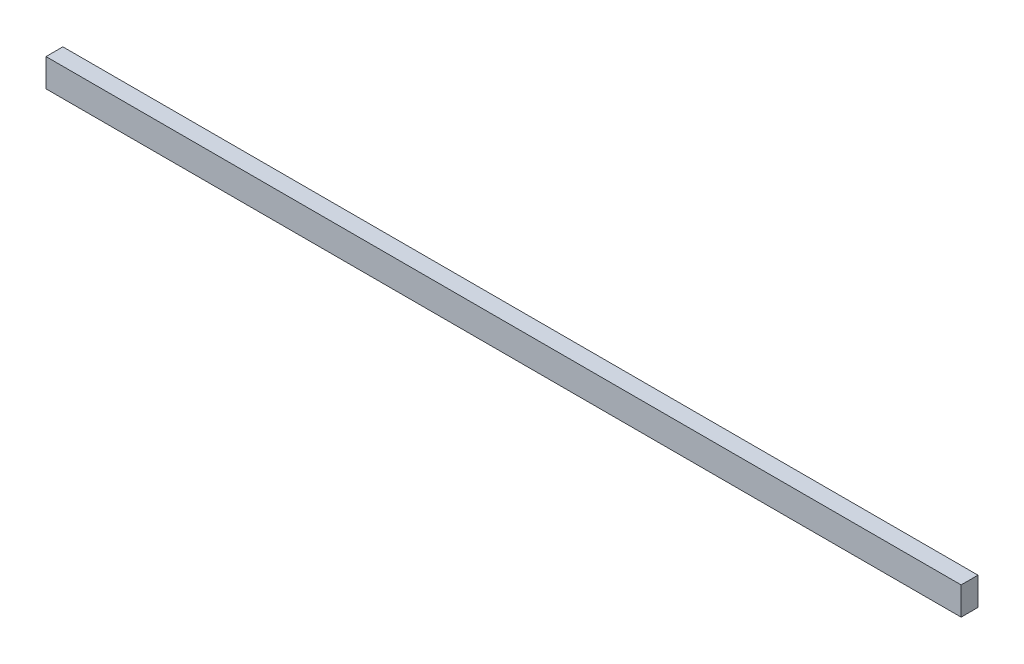
ISO-10303-21;
HEADER;
FILE_DESCRIPTION(('STEP AP214'),'2;1');
FILE_NAME('part.step','',(''),(''),'','','');
FILE_SCHEMA(('AUTOMOTIVE_DESIGN { 1 0 10303 214 1 1 1 1 }'));
ENDSEC;
DATA;
#1=APPLICATION_CONTEXT('core data for automotive mechanical design processes');
#2=APPLICATION_PROTOCOL_DEFINITION('international standard','automotive_design',2000,#1);
#3=PRODUCT_CONTEXT('',#1,'mechanical');
#4=PRODUCT('Part','Part','',(#3));
#5=PRODUCT_RELATED_PRODUCT_CATEGORY('part','',(#4));
#6=PRODUCT_DEFINITION_FORMATION('','',#4);
#7=PRODUCT_DEFINITION_CONTEXT('part definition',#1,'design');
#8=PRODUCT_DEFINITION('design','',#6,#7);
#9=PRODUCT_DEFINITION_SHAPE('','',#8);
#10=(LENGTH_UNIT() NAMED_UNIT(*) SI_UNIT(.MILLI.,.METRE.));
#11=(NAMED_UNIT(*) PLANE_ANGLE_UNIT() SI_UNIT($,.RADIAN.));
#12=(NAMED_UNIT(*) SI_UNIT($,.STERADIAN.) SOLID_ANGLE_UNIT());
#13=UNCERTAINTY_MEASURE_WITH_UNIT(LENGTH_MEASURE(1.E-05),#10,'distance_accuracy_value','');
#14=(GEOMETRIC_REPRESENTATION_CONTEXT(3) GLOBAL_UNCERTAINTY_ASSIGNED_CONTEXT((#13)) GLOBAL_UNIT_ASSIGNED_CONTEXT((#10,
#11,#12)) REPRESENTATION_CONTEXT('',''));
#15=CARTESIAN_POINT('',(0.,0.,0.));
#16=DIRECTION('',(0.,0.,1.));
#17=DIRECTION('',(1.,0.,0.));
#18=AXIS2_PLACEMENT_3D('',#15,#16,#17);
#19=CARTESIAN_POINT('',(571.499999999999,17.4667625569214,-12.7));
#20=DIRECTION('',(1.,0.,0.));
#21=DIRECTION('',(0.,0.,-1.));
#22=AXIS2_PLACEMENT_3D('',#19,#20,#21);
#23=PLANE('',#22);
#24=DIRECTION('',(0.,0.,1.));
#25=VECTOR('',#24,1.);
#26=CARTESIAN_POINT('',(571.499999999999,17.4667625569214,-12.7));
#27=LINE('',#26,#25);
#28=CARTESIAN_POINT('',(571.499999999999,17.4667625569214,-12.7));
#29=VERTEX_POINT('',#28);
#30=CARTESIAN_POINT('',(571.499999999999,17.4667625569214,8.382));
#31=VERTEX_POINT('',#30);
#32=EDGE_CURVE('E42',#29,#31,#27,.T.);
#33=ORIENTED_EDGE('',*,*,#32,.T.);
#34=DIRECTION('',(0.,1.,0.));
#35=VECTOR('',#34,1.);
#36=CARTESIAN_POINT('',(571.499999999999,17.4667625569214,8.382));
#37=LINE('',#36,#35);
#38=CARTESIAN_POINT('',(571.499999999999,-17.4667625569214,8.382));
#39=VERTEX_POINT('',#38);
#40=EDGE_CURVE('E80',#39,#31,#37,.T.);
#41=ORIENTED_EDGE('',*,*,#40,.F.);
#42=DIRECTION('',(0.,0.,1.));
#43=VECTOR('',#42,1.);
#44=CARTESIAN_POINT('',(571.499999999999,-17.4667625569214,-12.7));
#45=LINE('',#44,#43);
#46=CARTESIAN_POINT('',(571.499999999999,-17.4667625569214,-12.7));
#47=VERTEX_POINT('',#46);
#48=EDGE_CURVE('E11',#47,#39,#45,.T.);
#49=ORIENTED_EDGE('',*,*,#48,.F.);
#50=DIRECTION('',(0.,1.,0.));
#51=VECTOR('',#50,1.);
#52=CARTESIAN_POINT('',(571.499999999999,17.4667625569214,-12.7));
#53=LINE('',#52,#51);
#54=EDGE_CURVE('E81',#47,#29,#53,.T.);
#55=ORIENTED_EDGE('',*,*,#54,.T.);
#56=EDGE_LOOP('',(#33,#41,#49,#55));
#57=FACE_BOUND('',#56,.T.);
#58=ADVANCED_FACE('F39',(#57),#23,.T.);
#59=CARTESIAN_POINT('',(-571.500000000001,-17.4667625569214,-12.7));
#60=DIRECTION('',(0.,-1.,0.));
#61=DIRECTION('',(0.,0.,-1.));
#62=AXIS2_PLACEMENT_3D('',#59,#60,#61);
#63=PLANE('',#62);
#64=ORIENTED_EDGE('',*,*,#48,.T.);
#65=DIRECTION('',(1.,0.,0.));
#66=VECTOR('',#65,1.);
#67=CARTESIAN_POINT('',(-571.500000000001,-17.4667625569214,8.382));
#68=LINE('',#67,#66);
#69=CARTESIAN_POINT('',(-571.500000000001,-17.4667625569214,8.382));
#70=VERTEX_POINT('',#69);
#71=EDGE_CURVE('E99',#70,#39,#68,.T.);
#72=ORIENTED_EDGE('',*,*,#71,.F.);
#73=DIRECTION('',(0.,0.,1.));
#74=VECTOR('',#73,1.);
#75=CARTESIAN_POINT('',(-571.500000000001,-17.4667625569214,-12.7));
#76=LINE('',#75,#74);
#77=CARTESIAN_POINT('',(-571.500000000001,-17.4667625569214,-12.7));
#78=VERTEX_POINT('',#77);
#79=EDGE_CURVE('E48',#78,#70,#76,.T.);
#80=ORIENTED_EDGE('',*,*,#79,.F.);
#81=DIRECTION('',(1.,0.,0.));
#82=VECTOR('',#81,1.);
#83=CARTESIAN_POINT('',(-571.500000000001,-17.4667625569214,-12.7));
#84=LINE('',#83,#82);
#85=EDGE_CURVE('E87',#78,#47,#84,.T.);
#86=ORIENTED_EDGE('',*,*,#85,.T.);
#87=EDGE_LOOP('',(#64,#72,#80,#86));
#88=FACE_BOUND('',#87,.T.);
#89=ADVANCED_FACE('F123',(#88),#63,.T.);
#90=CARTESIAN_POINT('',(-571.500000000001,17.4667625569214,-12.7));
#91=DIRECTION('',(-1.,0.,0.));
#92=DIRECTION('',(0.,0.,1.));
#93=AXIS2_PLACEMENT_3D('',#90,#91,#92);
#94=PLANE('',#93);
#95=ORIENTED_EDGE('',*,*,#79,.T.);
#96=DIRECTION('',(0.,-1.,0.));
#97=VECTOR('',#96,1.);
#98=CARTESIAN_POINT('',(-571.500000000001,17.4667625569214,8.382));
#99=LINE('',#98,#97);
#100=CARTESIAN_POINT('',(-571.500000000001,17.4667625569214,8.382));
#101=VERTEX_POINT('',#100);
#102=EDGE_CURVE('E95',#101,#70,#99,.T.);
#103=ORIENTED_EDGE('',*,*,#102,.F.);
#104=DIRECTION('',(0.,0.,1.));
#105=VECTOR('',#104,1.);
#106=CARTESIAN_POINT('',(-571.500000000001,17.4667625569214,-12.7));
#107=LINE('',#106,#105);
#108=CARTESIAN_POINT('',(-571.500000000001,17.4667625569214,-12.7));
#109=VERTEX_POINT('',#108);
#110=EDGE_CURVE('E86',#109,#101,#107,.T.);
#111=ORIENTED_EDGE('',*,*,#110,.F.);
#112=DIRECTION('',(0.,-1.,0.));
#113=VECTOR('',#112,1.);
#114=CARTESIAN_POINT('',(-571.500000000001,17.4667625569214,-12.7));
#115=LINE('',#114,#113);
#116=EDGE_CURVE('E112',#109,#78,#115,.T.);
#117=ORIENTED_EDGE('',*,*,#116,.T.);
#118=EDGE_LOOP('',(#95,#103,#111,#117));
#119=FACE_BOUND('',#118,.T.);
#120=ADVANCED_FACE('F120',(#119),#94,.T.);
#121=CARTESIAN_POINT('',(-571.500000000001,17.4667625569214,-12.7));
#122=DIRECTION('',(0.,1.,0.));
#123=DIRECTION('',(0.,0.,1.));
#124=AXIS2_PLACEMENT_3D('',#121,#122,#123);
#125=PLANE('',#124);
#126=ORIENTED_EDGE('',*,*,#110,.T.);
#127=DIRECTION('',(-1.,0.,0.));
#128=VECTOR('',#127,1.);
#129=CARTESIAN_POINT('',(-571.500000000001,17.4667625569214,8.382));
#130=LINE('',#129,#128);
#131=EDGE_CURVE('E89',#31,#101,#130,.T.);
#132=ORIENTED_EDGE('',*,*,#131,.F.);
#133=ORIENTED_EDGE('',*,*,#32,.F.);
#134=DIRECTION('',(-1.,0.,0.));
#135=VECTOR('',#134,1.);
#136=CARTESIAN_POINT('',(-571.500000000001,17.4667625569214,-12.7));
#137=LINE('',#136,#135);
#138=EDGE_CURVE('E109',#29,#109,#137,.T.);
#139=ORIENTED_EDGE('',*,*,#138,.T.);
#140=EDGE_LOOP('',(#126,#132,#133,#139));
#141=FACE_BOUND('',#140,.T.);
#142=ADVANCED_FACE('F90',(#141),#125,.T.);
#143=CARTESIAN_POINT('',(0.,0.,-12.7));
#144=DIRECTION('',(0.,0.,1.));
#145=DIRECTION('',(1.,0.,0.));
#146=AXIS2_PLACEMENT_3D('',#143,#144,#145);
#147=PLANE('',#146);
#148=ORIENTED_EDGE('',*,*,#54,.F.);
#149=ORIENTED_EDGE('',*,*,#85,.F.);
#150=ORIENTED_EDGE('',*,*,#116,.F.);
#151=ORIENTED_EDGE('',*,*,#138,.F.);
#152=EDGE_LOOP('',(#148,#149,#150,#151));
#153=FACE_BOUND('',#152,.T.);
#154=ADVANCED_FACE('F125',(#153),#147,.F.);
#155=CARTESIAN_POINT('',(0.,0.,8.382));
#156=DIRECTION('',(0.,0.,1.));
#157=DIRECTION('',(1.,0.,0.));
#158=AXIS2_PLACEMENT_3D('',#155,#156,#157);
#159=PLANE('',#158);
#160=ORIENTED_EDGE('',*,*,#40,.T.);
#161=ORIENTED_EDGE('',*,*,#131,.T.);
#162=ORIENTED_EDGE('',*,*,#102,.T.);
#163=ORIENTED_EDGE('',*,*,#71,.T.);
#164=EDGE_LOOP('',(#160,#161,#162,#163));
#165=FACE_BOUND('',#164,.T.);
#166=ADVANCED_FACE('F98',(#165),#159,.T.);
#167=CLOSED_SHELL('',(#58,#89,#120,#142,#154,#166));
#168=MANIFOLD_SOLID_BREP('B2',#167);
#169=ADVANCED_BREP_SHAPE_REPRESENTATION('',(#18,#168),#14);
#170=SHAPE_DEFINITION_REPRESENTATION(#9,#169);
ENDSEC;
END-ISO-10303-21;
